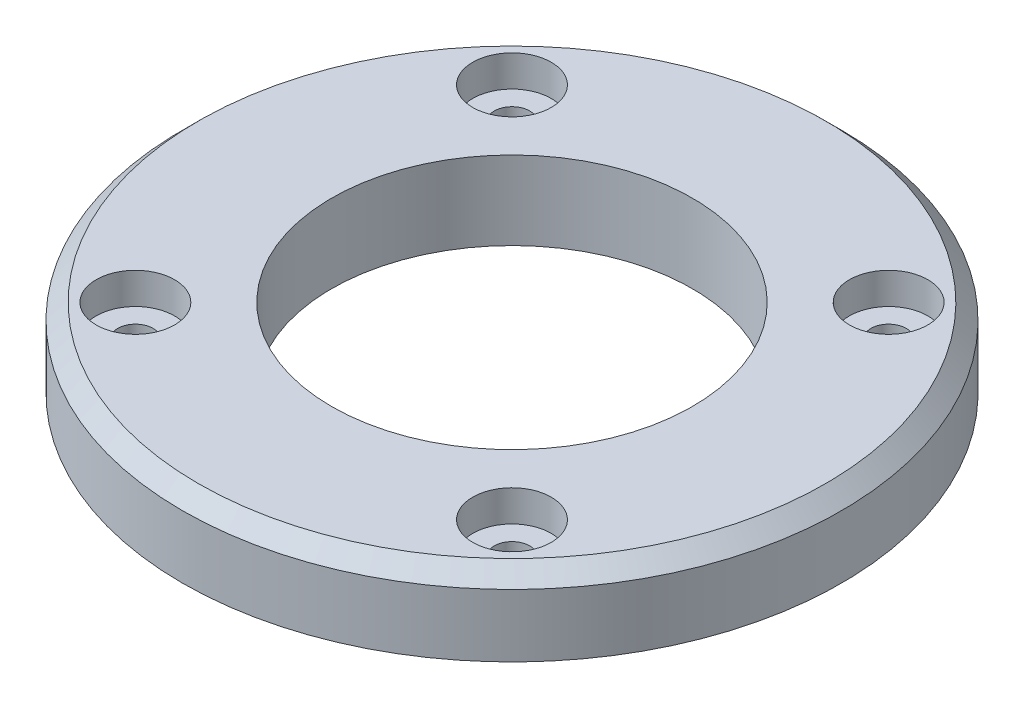
ISO-10303-21;
HEADER;
FILE_DESCRIPTION(('STEP AP214'),'2;1');
FILE_NAME('part.step','',(''),(''),'','','');
FILE_SCHEMA(('AUTOMOTIVE_DESIGN { 1 0 10303 214 1 1 1 1 }'));
ENDSEC;
DATA;
#1=APPLICATION_CONTEXT('core data for automotive mechanical design processes');
#2=APPLICATION_PROTOCOL_DEFINITION('international standard','automotive_design',2000,#1);
#3=PRODUCT_CONTEXT('',#1,'mechanical');
#4=PRODUCT('Part','Part','',(#3));
#5=PRODUCT_RELATED_PRODUCT_CATEGORY('part','',(#4));
#6=PRODUCT_DEFINITION_FORMATION('','',#4);
#7=PRODUCT_DEFINITION_CONTEXT('part definition',#1,'design');
#8=PRODUCT_DEFINITION('design','',#6,#7);
#9=PRODUCT_DEFINITION_SHAPE('','',#8);
#10=(LENGTH_UNIT() NAMED_UNIT(*) SI_UNIT(.MILLI.,.METRE.));
#11=(NAMED_UNIT(*) PLANE_ANGLE_UNIT() SI_UNIT($,.RADIAN.));
#12=(NAMED_UNIT(*) SI_UNIT($,.STERADIAN.) SOLID_ANGLE_UNIT());
#13=UNCERTAINTY_MEASURE_WITH_UNIT(LENGTH_MEASURE(1.E-05),#10,'distance_accuracy_value','');
#14=(GEOMETRIC_REPRESENTATION_CONTEXT(3) GLOBAL_UNCERTAINTY_ASSIGNED_CONTEXT((#13)) GLOBAL_UNIT_ASSIGNED_CONTEXT((#10,
#11,#12)) REPRESENTATION_CONTEXT('',''));
#15=CARTESIAN_POINT('',(0.,0.,0.));
#16=DIRECTION('',(0.,0.,1.));
#17=DIRECTION('',(1.,0.,0.));
#18=AXIS2_PLACEMENT_3D('',#15,#16,#17);
#19=CARTESIAN_POINT('',(0.,10.,0.));
#20=DIRECTION('',(0.,1.,0.));
#21=DIRECTION('',(0.,0.,1.));
#22=AXIS2_PLACEMENT_3D('',#19,#20,#21);
#23=PLANE('',#22);
#24=CARTESIAN_POINT('',(0.,10.,0.));
#25=DIRECTION('',(0.,1.,0.));
#26=DIRECTION('',(0.,0.,1.));
#27=AXIS2_PLACEMENT_3D('',#24,#25,#26);
#28=CIRCLE('',#27,40.0000000000001);
#29=CARTESIAN_POINT('',(0.,10.,40.0000000000001));
#30=VERTEX_POINT('',#29);
#31=EDGE_CURVE('E43',#30,#30,#28,.T.);
#32=ORIENTED_EDGE('',*,*,#31,.T.);
#33=EDGE_LOOP('',(#32));
#34=FACE_BOUND('',#33,.T.);
#35=CARTESIAN_POINT('',(-24.,10.,-24.));
#36=DIRECTION('',(0.,1.,0.));
#37=DIRECTION('',(0.,0.,1.));
#38=AXIS2_PLACEMENT_3D('',#35,#36,#37);
#39=CIRCLE('',#38,5.);
#40=CARTESIAN_POINT('',(-24.,10.,-19.));
#41=VERTEX_POINT('',#40);
#42=EDGE_CURVE('E104',#41,#41,#39,.T.);
#43=ORIENTED_EDGE('',*,*,#42,.F.);
#44=EDGE_LOOP('',(#43));
#45=FACE_BOUND('',#44,.T.);
#46=CARTESIAN_POINT('',(24.,10.,-24.));
#47=DIRECTION('',(0.,1.,0.));
#48=DIRECTION('',(0.,0.,1.));
#49=AXIS2_PLACEMENT_3D('',#46,#47,#48);
#50=CIRCLE('',#49,5.);
#51=CARTESIAN_POINT('',(24.,10.,-19.));
#52=VERTEX_POINT('',#51);
#53=EDGE_CURVE('E57',#52,#52,#50,.T.);
#54=ORIENTED_EDGE('',*,*,#53,.F.);
#55=EDGE_LOOP('',(#54));
#56=FACE_BOUND('',#55,.T.);
#57=CARTESIAN_POINT('',(24.,10.,24.));
#58=DIRECTION('',(0.,1.,0.));
#59=DIRECTION('',(0.,0.,1.));
#60=AXIS2_PLACEMENT_3D('',#57,#58,#59);
#61=CIRCLE('',#60,5.);
#62=CARTESIAN_POINT('',(24.,10.,29.));
#63=VERTEX_POINT('',#62);
#64=EDGE_CURVE('E62',#63,#63,#61,.T.);
#65=ORIENTED_EDGE('',*,*,#64,.F.);
#66=EDGE_LOOP('',(#65));
#67=FACE_BOUND('',#66,.T.);
#68=CARTESIAN_POINT('',(-24.,10.,24.));
#69=DIRECTION('',(0.,1.,0.));
#70=DIRECTION('',(0.,0.,1.));
#71=AXIS2_PLACEMENT_3D('',#68,#69,#70);
#72=CIRCLE('',#71,5.);
#73=CARTESIAN_POINT('',(-24.,10.,29.));
#74=VERTEX_POINT('',#73);
#75=EDGE_CURVE('E67',#74,#74,#72,.T.);
#76=ORIENTED_EDGE('',*,*,#75,.F.);
#77=EDGE_LOOP('',(#76));
#78=FACE_BOUND('',#77,.T.);
#79=CARTESIAN_POINT('',(0.,10.,0.));
#80=DIRECTION('',(0.,1.,0.));
#81=DIRECTION('',(0.,0.,1.));
#82=AXIS2_PLACEMENT_3D('',#79,#80,#81);
#83=CIRCLE('',#82,23.);
#84=CARTESIAN_POINT('',(0.,10.,23.));
#85=VERTEX_POINT('',#84);
#86=EDGE_CURVE('E51',#85,#85,#83,.T.);
#87=ORIENTED_EDGE('',*,*,#86,.F.);
#88=EDGE_LOOP('',(#87));
#89=FACE_BOUND('',#88,.T.);
#90=ADVANCED_FACE('F36',(#34,#45,#56,#67,#78,#89),#23,.T.);
#91=CARTESIAN_POINT('',(0.,0.,0.));
#92=DIRECTION('',(0.,1.,0.));
#93=DIRECTION('',(0.,0.,1.));
#94=AXIS2_PLACEMENT_3D('',#91,#92,#93);
#95=PLANE('',#94);
#96=CARTESIAN_POINT('',(-24.,0.,-24.));
#97=DIRECTION('',(0.,1.,0.));
#98=DIRECTION('',(0.,0.,1.));
#99=AXIS2_PLACEMENT_3D('',#96,#97,#98);
#100=CIRCLE('',#99,2.25);
#101=CARTESIAN_POINT('',(-24.,0.,-21.75));
#102=VERTEX_POINT('',#101);
#103=EDGE_CURVE('E54',#102,#102,#100,.T.);
#104=ORIENTED_EDGE('',*,*,#103,.T.);
#105=EDGE_LOOP('',(#104));
#106=FACE_BOUND('',#105,.T.);
#107=CARTESIAN_POINT('',(24.,0.,-24.));
#108=DIRECTION('',(0.,1.,0.));
#109=DIRECTION('',(0.,0.,1.));
#110=AXIS2_PLACEMENT_3D('',#107,#108,#109);
#111=CIRCLE('',#110,2.25);
#112=CARTESIAN_POINT('',(24.,0.,-21.75));
#113=VERTEX_POINT('',#112);
#114=EDGE_CURVE('E59',#113,#113,#111,.T.);
#115=ORIENTED_EDGE('',*,*,#114,.T.);
#116=EDGE_LOOP('',(#115));
#117=FACE_BOUND('',#116,.T.);
#118=CARTESIAN_POINT('',(24.,0.,24.));
#119=DIRECTION('',(0.,1.,0.));
#120=DIRECTION('',(0.,0.,1.));
#121=AXIS2_PLACEMENT_3D('',#118,#119,#120);
#122=CIRCLE('',#121,2.25);
#123=CARTESIAN_POINT('',(24.,0.,26.25));
#124=VERTEX_POINT('',#123);
#125=EDGE_CURVE('E64',#124,#124,#122,.T.);
#126=ORIENTED_EDGE('',*,*,#125,.T.);
#127=EDGE_LOOP('',(#126));
#128=FACE_BOUND('',#127,.T.);
#129=CARTESIAN_POINT('',(-24.,0.,24.));
#130=DIRECTION('',(0.,1.,0.));
#131=DIRECTION('',(0.,0.,1.));
#132=AXIS2_PLACEMENT_3D('',#129,#130,#131);
#133=CIRCLE('',#132,2.25);
#134=CARTESIAN_POINT('',(-24.,0.,26.25));
#135=VERTEX_POINT('',#134);
#136=EDGE_CURVE('E69',#135,#135,#133,.T.);
#137=ORIENTED_EDGE('',*,*,#136,.T.);
#138=EDGE_LOOP('',(#137));
#139=FACE_BOUND('',#138,.T.);
#140=CARTESIAN_POINT('',(0.,0.,0.));
#141=DIRECTION('',(0.,1.,0.));
#142=DIRECTION('',(0.,0.,1.));
#143=AXIS2_PLACEMENT_3D('',#140,#141,#142);
#144=CIRCLE('',#143,42.);
#145=CARTESIAN_POINT('',(0.,0.,42.));
#146=VERTEX_POINT('',#145);
#147=EDGE_CURVE('E47',#146,#146,#144,.T.);
#148=ORIENTED_EDGE('',*,*,#147,.F.);
#149=EDGE_LOOP('',(#148));
#150=FACE_BOUND('',#149,.T.);
#151=CARTESIAN_POINT('',(0.,0.,0.));
#152=DIRECTION('',(0.,1.,0.));
#153=DIRECTION('',(0.,0.,1.));
#154=AXIS2_PLACEMENT_3D('',#151,#152,#153);
#155=CIRCLE('',#154,23.);
#156=CARTESIAN_POINT('',(0.,0.,23.));
#157=VERTEX_POINT('',#156);
#158=EDGE_CURVE('E71',#157,#157,#155,.T.);
#159=ORIENTED_EDGE('',*,*,#158,.T.);
#160=EDGE_LOOP('',(#159));
#161=FACE_BOUND('',#160,.T.);
#162=ADVANCED_FACE('F112',(#106,#117,#128,#139,#150,#161),#95,.F.);
#163=CARTESIAN_POINT('',(0.,10.,0.));
#164=DIRECTION('',(0.,-1.,0.));
#165=DIRECTION('',(0.,0.,-1.));
#166=AXIS2_PLACEMENT_3D('',#163,#164,#165);
#167=CYLINDRICAL_SURFACE('',#166,42.);
#168=CARTESIAN_POINT('',(0.,8.00000000000003,0.));
#169=DIRECTION('',(0.,1.,0.));
#170=DIRECTION('',(0.,0.,1.));
#171=AXIS2_PLACEMENT_3D('',#168,#169,#170);
#172=CIRCLE('',#171,42.);
#173=CARTESIAN_POINT('',(0.,8.00000000000003,42.));
#174=VERTEX_POINT('',#173);
#175=EDGE_CURVE('E10',#174,#174,#172,.F.);
#176=ORIENTED_EDGE('',*,*,#175,.T.);
#177=EDGE_LOOP('',(#176));
#178=FACE_BOUND('',#177,.T.);
#179=ORIENTED_EDGE('',*,*,#147,.T.);
#180=EDGE_LOOP('',(#179));
#181=FACE_BOUND('',#180,.T.);
#182=ADVANCED_FACE('F126',(#178,#181),#167,.T.);
#183=CARTESIAN_POINT('',(0.,10.,0.));
#184=DIRECTION('',(0.,-1.,0.));
#185=DIRECTION('',(0.,0.,-1.));
#186=AXIS2_PLACEMENT_3D('',#183,#184,#185);
#187=CYLINDRICAL_SURFACE('',#186,23.);
#188=ORIENTED_EDGE('',*,*,#86,.T.);
#189=EDGE_LOOP('',(#188));
#190=FACE_BOUND('',#189,.T.);
#191=ORIENTED_EDGE('',*,*,#158,.F.);
#192=EDGE_LOOP('',(#191));
#193=FACE_BOUND('',#192,.T.);
#194=ADVANCED_FACE('F122',(#190,#193),#187,.F.);
#195=CARTESIAN_POINT('',(-24.,10.,24.));
#196=DIRECTION('',(0.,1.,0.));
#197=DIRECTION('',(0.,0.,1.));
#198=AXIS2_PLACEMENT_3D('',#195,#196,#197);
#199=CYLINDRICAL_SURFACE('',#198,2.25);
#200=CARTESIAN_POINT('',(-24.,6.,24.));
#201=DIRECTION('',(0.,1.,0.));
#202=DIRECTION('',(0.,0.,1.));
#203=AXIS2_PLACEMENT_3D('',#200,#201,#202);
#204=CIRCLE('',#203,2.25);
#205=CARTESIAN_POINT('',(-24.,6.,26.25));
#206=VERTEX_POINT('',#205);
#207=EDGE_CURVE('E72',#206,#206,#204,.T.);
#208=ORIENTED_EDGE('',*,*,#207,.T.);
#209=EDGE_LOOP('',(#208));
#210=FACE_BOUND('',#209,.T.);
#211=ORIENTED_EDGE('',*,*,#136,.F.);
#212=EDGE_LOOP('',(#211));
#213=FACE_BOUND('',#212,.T.);
#214=ADVANCED_FACE('F125',(#210,#213),#199,.F.);
#215=CARTESIAN_POINT('',(-21.75,6.,24.));
#216=DIRECTION('',(0.,-1.,0.));
#217=DIRECTION('',(0.,0.,-1.));
#218=AXIS2_PLACEMENT_3D('',#215,#216,#217);
#219=PLANE('',#218);
#220=ORIENTED_EDGE('',*,*,#207,.F.);
#221=EDGE_LOOP('',(#220));
#222=FACE_BOUND('',#221,.T.);
#223=CARTESIAN_POINT('',(-24.,6.,24.));
#224=DIRECTION('',(0.,1.,0.));
#225=DIRECTION('',(0.,0.,1.));
#226=AXIS2_PLACEMENT_3D('',#223,#224,#225);
#227=CIRCLE('',#226,5.);
#228=CARTESIAN_POINT('',(-24.,6.,29.));
#229=VERTEX_POINT('',#228);
#230=EDGE_CURVE('E80',#229,#229,#227,.T.);
#231=ORIENTED_EDGE('',*,*,#230,.T.);
#232=EDGE_LOOP('',(#231));
#233=FACE_BOUND('',#232,.T.);
#234=ADVANCED_FACE('F140',(#222,#233),#219,.F.);
#235=CARTESIAN_POINT('',(-24.,10.,24.));
#236=DIRECTION('',(0.,1.,0.));
#237=DIRECTION('',(0.,0.,1.));
#238=AXIS2_PLACEMENT_3D('',#235,#236,#237);
#239=CYLINDRICAL_SURFACE('',#238,5.);
#240=ORIENTED_EDGE('',*,*,#230,.F.);
#241=EDGE_LOOP('',(#240));
#242=FACE_BOUND('',#241,.T.);
#243=ORIENTED_EDGE('',*,*,#75,.T.);
#244=EDGE_LOOP('',(#243));
#245=FACE_BOUND('',#244,.T.);
#246=ADVANCED_FACE('F144',(#242,#245),#239,.F.);
#247=CARTESIAN_POINT('',(24.,10.,24.));
#248=DIRECTION('',(0.,1.,0.));
#249=DIRECTION('',(0.,0.,1.));
#250=AXIS2_PLACEMENT_3D('',#247,#248,#249);
#251=CYLINDRICAL_SURFACE('',#250,2.25);
#252=CARTESIAN_POINT('',(24.,6.,24.));
#253=DIRECTION('',(0.,1.,0.));
#254=DIRECTION('',(0.,0.,1.));
#255=AXIS2_PLACEMENT_3D('',#252,#253,#254);
#256=CIRCLE('',#255,2.25);
#257=CARTESIAN_POINT('',(24.,6.,26.25));
#258=VERTEX_POINT('',#257);
#259=EDGE_CURVE('E68',#258,#258,#256,.T.);
#260=ORIENTED_EDGE('',*,*,#259,.T.);
#261=EDGE_LOOP('',(#260));
#262=FACE_BOUND('',#261,.T.);
#263=ORIENTED_EDGE('',*,*,#125,.F.);
#264=EDGE_LOOP('',(#263));
#265=FACE_BOUND('',#264,.T.);
#266=ADVANCED_FACE('F148',(#262,#265),#251,.F.);
#267=CARTESIAN_POINT('',(26.25,6.,24.));
#268=DIRECTION('',(0.,-1.,0.));
#269=DIRECTION('',(0.,0.,-1.));
#270=AXIS2_PLACEMENT_3D('',#267,#268,#269);
#271=PLANE('',#270);
#272=ORIENTED_EDGE('',*,*,#259,.F.);
#273=EDGE_LOOP('',(#272));
#274=FACE_BOUND('',#273,.T.);
#275=CARTESIAN_POINT('',(24.,6.,24.));
#276=DIRECTION('',(0.,1.,0.));
#277=DIRECTION('',(0.,0.,1.));
#278=AXIS2_PLACEMENT_3D('',#275,#276,#277);
#279=CIRCLE('',#278,5.);
#280=CARTESIAN_POINT('',(24.,6.,29.));
#281=VERTEX_POINT('',#280);
#282=EDGE_CURVE('E87',#281,#281,#279,.T.);
#283=ORIENTED_EDGE('',*,*,#282,.T.);
#284=EDGE_LOOP('',(#283));
#285=FACE_BOUND('',#284,.T.);
#286=ADVANCED_FACE('F152',(#274,#285),#271,.F.);
#287=CARTESIAN_POINT('',(24.,10.,24.));
#288=DIRECTION('',(0.,1.,0.));
#289=DIRECTION('',(0.,0.,1.));
#290=AXIS2_PLACEMENT_3D('',#287,#288,#289);
#291=CYLINDRICAL_SURFACE('',#290,5.);
#292=ORIENTED_EDGE('',*,*,#282,.F.);
#293=EDGE_LOOP('',(#292));
#294=FACE_BOUND('',#293,.T.);
#295=ORIENTED_EDGE('',*,*,#64,.T.);
#296=EDGE_LOOP('',(#295));
#297=FACE_BOUND('',#296,.T.);
#298=ADVANCED_FACE('F156',(#294,#297),#291,.F.);
#299=CARTESIAN_POINT('',(24.,10.,-24.));
#300=DIRECTION('',(0.,1.,0.));
#301=DIRECTION('',(0.,0.,1.));
#302=AXIS2_PLACEMENT_3D('',#299,#300,#301);
#303=CYLINDRICAL_SURFACE('',#302,2.25);
#304=CARTESIAN_POINT('',(24.,6.,-24.));
#305=DIRECTION('',(0.,1.,0.));
#306=DIRECTION('',(0.,0.,1.));
#307=AXIS2_PLACEMENT_3D('',#304,#305,#306);
#308=CIRCLE('',#307,2.25);
#309=CARTESIAN_POINT('',(24.,6.,-21.75));
#310=VERTEX_POINT('',#309);
#311=EDGE_CURVE('E63',#310,#310,#308,.T.);
#312=ORIENTED_EDGE('',*,*,#311,.T.);
#313=EDGE_LOOP('',(#312));
#314=FACE_BOUND('',#313,.T.);
#315=ORIENTED_EDGE('',*,*,#114,.F.);
#316=EDGE_LOOP('',(#315));
#317=FACE_BOUND('',#316,.T.);
#318=ADVANCED_FACE('F160',(#314,#317),#303,.F.);
#319=CARTESIAN_POINT('',(26.25,6.,-24.));
#320=DIRECTION('',(0.,-1.,0.));
#321=DIRECTION('',(0.,0.,-1.));
#322=AXIS2_PLACEMENT_3D('',#319,#320,#321);
#323=PLANE('',#322);
#324=ORIENTED_EDGE('',*,*,#311,.F.);
#325=EDGE_LOOP('',(#324));
#326=FACE_BOUND('',#325,.T.);
#327=CARTESIAN_POINT('',(24.,6.,-24.));
#328=DIRECTION('',(0.,1.,0.));
#329=DIRECTION('',(0.,0.,1.));
#330=AXIS2_PLACEMENT_3D('',#327,#328,#329);
#331=CIRCLE('',#330,5.);
#332=CARTESIAN_POINT('',(24.,6.,-19.));
#333=VERTEX_POINT('',#332);
#334=EDGE_CURVE('E94',#333,#333,#331,.T.);
#335=ORIENTED_EDGE('',*,*,#334,.T.);
#336=EDGE_LOOP('',(#335));
#337=FACE_BOUND('',#336,.T.);
#338=ADVANCED_FACE('F164',(#326,#337),#323,.F.);
#339=CARTESIAN_POINT('',(24.,10.,-24.));
#340=DIRECTION('',(0.,1.,0.));
#341=DIRECTION('',(0.,0.,1.));
#342=AXIS2_PLACEMENT_3D('',#339,#340,#341);
#343=CYLINDRICAL_SURFACE('',#342,5.);
#344=ORIENTED_EDGE('',*,*,#334,.F.);
#345=EDGE_LOOP('',(#344));
#346=FACE_BOUND('',#345,.T.);
#347=ORIENTED_EDGE('',*,*,#53,.T.);
#348=EDGE_LOOP('',(#347));
#349=FACE_BOUND('',#348,.T.);
#350=ADVANCED_FACE('F168',(#346,#349),#343,.F.);
#351=CARTESIAN_POINT('',(-24.,10.,-24.));
#352=DIRECTION('',(0.,1.,0.));
#353=DIRECTION('',(0.,0.,1.));
#354=AXIS2_PLACEMENT_3D('',#351,#352,#353);
#355=CYLINDRICAL_SURFACE('',#354,2.25);
#356=CARTESIAN_POINT('',(-24.,6.,-24.));
#357=DIRECTION('',(0.,1.,0.));
#358=DIRECTION('',(0.,0.,1.));
#359=AXIS2_PLACEMENT_3D('',#356,#357,#358);
#360=CIRCLE('',#359,2.25);
#361=CARTESIAN_POINT('',(-24.,6.,-21.75));
#362=VERTEX_POINT('',#361);
#363=EDGE_CURVE('E58',#362,#362,#360,.T.);
#364=ORIENTED_EDGE('',*,*,#363,.T.);
#365=EDGE_LOOP('',(#364));
#366=FACE_BOUND('',#365,.T.);
#367=ORIENTED_EDGE('',*,*,#103,.F.);
#368=EDGE_LOOP('',(#367));
#369=FACE_BOUND('',#368,.T.);
#370=ADVANCED_FACE('F172',(#366,#369),#355,.F.);
#371=CARTESIAN_POINT('',(-21.75,6.,-24.));
#372=DIRECTION('',(0.,-1.,0.));
#373=DIRECTION('',(0.,0.,-1.));
#374=AXIS2_PLACEMENT_3D('',#371,#372,#373);
#375=PLANE('',#374);
#376=ORIENTED_EDGE('',*,*,#363,.F.);
#377=EDGE_LOOP('',(#376));
#378=FACE_BOUND('',#377,.T.);
#379=CARTESIAN_POINT('',(-24.,6.,-24.));
#380=DIRECTION('',(0.,1.,0.));
#381=DIRECTION('',(0.,0.,1.));
#382=AXIS2_PLACEMENT_3D('',#379,#380,#381);
#383=CIRCLE('',#382,5.);
#384=CARTESIAN_POINT('',(-24.,6.,-19.));
#385=VERTEX_POINT('',#384);
#386=EDGE_CURVE('E101',#385,#385,#383,.T.);
#387=ORIENTED_EDGE('',*,*,#386,.T.);
#388=EDGE_LOOP('',(#387));
#389=FACE_BOUND('',#388,.T.);
#390=ADVANCED_FACE('F176',(#378,#389),#375,.F.);
#391=CARTESIAN_POINT('',(-24.,10.,-24.));
#392=DIRECTION('',(0.,1.,0.));
#393=DIRECTION('',(0.,0.,1.));
#394=AXIS2_PLACEMENT_3D('',#391,#392,#393);
#395=CYLINDRICAL_SURFACE('',#394,5.);
#396=ORIENTED_EDGE('',*,*,#386,.F.);
#397=EDGE_LOOP('',(#396));
#398=FACE_BOUND('',#397,.T.);
#399=ORIENTED_EDGE('',*,*,#42,.T.);
#400=EDGE_LOOP('',(#399));
#401=FACE_BOUND('',#400,.T.);
#402=ADVANCED_FACE('F108',(#398,#401),#395,.F.);
#403=CARTESIAN_POINT('',(0.,10.,0.));
#404=DIRECTION('',(0.,-1.,0.));
#405=DIRECTION('',(0.,0.,-1.));
#406=AXIS2_PLACEMENT_3D('',#403,#404,#405);
#407=CONICAL_SURFACE('',#406,40.0000000000001,0.785398163397441);
#408=ORIENTED_EDGE('',*,*,#175,.F.);
#409=EDGE_LOOP('',(#408));
#410=FACE_BOUND('',#409,.T.);
#411=ORIENTED_EDGE('',*,*,#31,.F.);
#412=EDGE_LOOP('',(#411));
#413=FACE_BOUND('',#412,.T.);
#414=ADVANCED_FACE('F38',(#410,#413),#407,.T.);
#415=CLOSED_SHELL('',(#90,#162,#182,#194,#214,#234,#246,#266,#286,#298,#318,#338,#350,#370,#390,
#402,#414));
#416=MANIFOLD_SOLID_BREP('B2',#415);
#417=ADVANCED_BREP_SHAPE_REPRESENTATION('',(#18,#416),#14);
#418=SHAPE_DEFINITION_REPRESENTATION(#9,#417);
ENDSEC;
END-ISO-10303-21;
